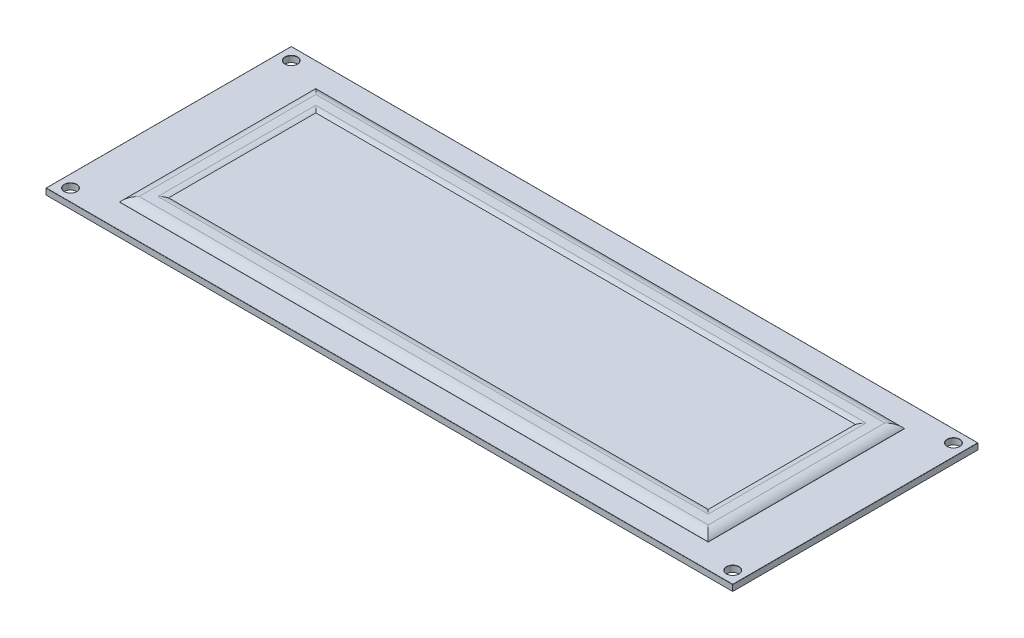
ISO-10303-21;
HEADER;
FILE_DESCRIPTION(('STEP AP214'),'2;1');
FILE_NAME('part.step','',(''),(''),'','','');
FILE_SCHEMA(('AUTOMOTIVE_DESIGN { 1 0 10303 214 1 1 1 1 }'));
ENDSEC;
DATA;
#1=APPLICATION_CONTEXT('core data for automotive mechanical design processes');
#2=APPLICATION_PROTOCOL_DEFINITION('international standard','automotive_design',2000,#1);
#3=PRODUCT_CONTEXT('',#1,'mechanical');
#4=PRODUCT('Part','Part','',(#3));
#5=PRODUCT_RELATED_PRODUCT_CATEGORY('part','',(#4));
#6=PRODUCT_DEFINITION_FORMATION('','',#4);
#7=PRODUCT_DEFINITION_CONTEXT('part definition',#1,'design');
#8=PRODUCT_DEFINITION('design','',#6,#7);
#9=PRODUCT_DEFINITION_SHAPE('','',#8);
#10=(LENGTH_UNIT() NAMED_UNIT(*) SI_UNIT(.MILLI.,.METRE.));
#11=(NAMED_UNIT(*) PLANE_ANGLE_UNIT() SI_UNIT($,.RADIAN.));
#12=(NAMED_UNIT(*) SI_UNIT($,.STERADIAN.) SOLID_ANGLE_UNIT());
#13=UNCERTAINTY_MEASURE_WITH_UNIT(LENGTH_MEASURE(1.E-05),#10,'distance_accuracy_value','');
#14=(GEOMETRIC_REPRESENTATION_CONTEXT(3) GLOBAL_UNCERTAINTY_ASSIGNED_CONTEXT((#13)) GLOBAL_UNIT_ASSIGNED_CONTEXT((#10,
#11,#12)) REPRESENTATION_CONTEXT('',''));
#15=CARTESIAN_POINT('',(0.,0.,0.));
#16=DIRECTION('',(0.,0.,1.));
#17=DIRECTION('',(1.,0.,0.));
#18=AXIS2_PLACEMENT_3D('',#15,#16,#17);
#19=CARTESIAN_POINT('',(120.441055718475,2.5,-153.293841642229));
#20=DIRECTION('',(1.,0.,0.));
#21=DIRECTION('',(0.,0.,-1.));
#22=AXIS2_PLACEMENT_3D('',#19,#20,#21);
#23=PLANE('',#22);
#24=DIRECTION('',(0.,-1.,0.));
#25=VECTOR('',#24,1.);
#26=CARTESIAN_POINT('',(120.441055718475,2.5,-53.2938416422287));
#27=LINE('',#26,#25);
#28=CARTESIAN_POINT('',(120.441055718475,2.4,-53.2938416422287));
#29=VERTEX_POINT('',#28);
#30=CARTESIAN_POINT('',(120.441055718475,0.,-53.2938416422287));
#31=VERTEX_POINT('',#30);
#32=EDGE_CURVE('E202',#29,#31,#27,.T.);
#33=ORIENTED_EDGE('',*,*,#32,.F.);
#34=DIRECTION('',(0.,0.,1.));
#35=VECTOR('',#34,1.);
#36=CARTESIAN_POINT('',(120.441055718475,2.4,-153.293841642229));
#37=LINE('',#36,#35);
#38=CARTESIAN_POINT('',(120.441055718475,2.4,-153.293841642229));
#39=VERTEX_POINT('',#38);
#40=EDGE_CURVE('E283',#29,#39,#37,.F.);
#41=ORIENTED_EDGE('',*,*,#40,.T.);
#42=DIRECTION('',(0.,-1.,0.));
#43=VECTOR('',#42,1.);
#44=CARTESIAN_POINT('',(120.441055718475,2.5,-153.293841642229));
#45=LINE('',#44,#43);
#46=CARTESIAN_POINT('',(120.441055718475,0.,-153.293841642229));
#47=VERTEX_POINT('',#46);
#48=EDGE_CURVE('E196',#39,#47,#45,.T.);
#49=ORIENTED_EDGE('',*,*,#48,.T.);
#50=DIRECTION('',(0.,0.,1.));
#51=VECTOR('',#50,1.);
#52=CARTESIAN_POINT('',(120.441055718475,0.,-153.293841642229));
#53=LINE('',#52,#51);
#54=EDGE_CURVE('E184',#47,#31,#53,.T.);
#55=ORIENTED_EDGE('',*,*,#54,.T.);
#56=EDGE_LOOP('',(#33,#41,#49,#55));
#57=FACE_BOUND('',#56,.T.);
#58=ADVANCED_FACE('F37',(#57),#23,.F.);
#59=CARTESIAN_POINT('',(120.441055718475,2.5,-53.2938416422287));
#60=DIRECTION('',(0.,0.,-1.));
#61=DIRECTION('',(-1.,0.,0.));
#62=AXIS2_PLACEMENT_3D('',#59,#60,#61);
#63=PLANE('',#62);
#64=DIRECTION('',(0.,-1.,0.));
#65=VECTOR('',#64,1.);
#66=CARTESIAN_POINT('',(400.441055718475,2.5,-53.2938416422287));
#67=LINE('',#66,#65);
#68=CARTESIAN_POINT('',(400.441055718475,2.4,-53.2938416422287));
#69=VERTEX_POINT('',#68);
#70=CARTESIAN_POINT('',(400.441055718475,0.,-53.2938416422287));
#71=VERTEX_POINT('',#70);
#72=EDGE_CURVE('E200',#69,#71,#67,.T.);
#73=ORIENTED_EDGE('',*,*,#72,.F.);
#74=DIRECTION('',(1.,0.,0.));
#75=VECTOR('',#74,1.);
#76=CARTESIAN_POINT('',(120.441055718475,2.4,-53.2938416422287));
#77=LINE('',#76,#75);
#78=EDGE_CURVE('E281',#69,#29,#77,.F.);
#79=ORIENTED_EDGE('',*,*,#78,.T.);
#80=ORIENTED_EDGE('',*,*,#32,.T.);
#81=DIRECTION('',(1.,0.,0.));
#82=VECTOR('',#81,1.);
#83=CARTESIAN_POINT('',(120.441055718475,0.,-53.2938416422287));
#84=LINE('',#83,#82);
#85=EDGE_CURVE('E187',#31,#71,#84,.T.);
#86=ORIENTED_EDGE('',*,*,#85,.T.);
#87=EDGE_LOOP('',(#73,#79,#80,#86));
#88=FACE_BOUND('',#87,.T.);
#89=ADVANCED_FACE('F363',(#88),#63,.F.);
#90=CARTESIAN_POINT('',(400.441055718475,2.5,-153.293841642229));
#91=DIRECTION('',(-1.,0.,0.));
#92=DIRECTION('',(0.,0.,1.));
#93=AXIS2_PLACEMENT_3D('',#90,#91,#92);
#94=PLANE('',#93);
#95=DIRECTION('',(0.,-1.,0.));
#96=VECTOR('',#95,1.);
#97=CARTESIAN_POINT('',(400.441055718475,2.5,-153.293841642229));
#98=LINE('',#97,#96);
#99=CARTESIAN_POINT('',(400.441055718475,2.4,-153.293841642229));
#100=VERTEX_POINT('',#99);
#101=CARTESIAN_POINT('',(400.441055718475,0.,-153.293841642229));
#102=VERTEX_POINT('',#101);
#103=EDGE_CURVE('E198',#100,#102,#98,.T.);
#104=ORIENTED_EDGE('',*,*,#103,.F.);
#105=DIRECTION('',(0.,0.,-1.));
#106=VECTOR('',#105,1.);
#107=CARTESIAN_POINT('',(400.441055718475,2.4,-53.2938416422287));
#108=LINE('',#107,#106);
#109=EDGE_CURVE('E279',#100,#69,#108,.F.);
#110=ORIENTED_EDGE('',*,*,#109,.T.);
#111=ORIENTED_EDGE('',*,*,#72,.T.);
#112=DIRECTION('',(0.,0.,-1.));
#113=VECTOR('',#112,1.);
#114=CARTESIAN_POINT('',(400.441055718475,0.,-153.293841642229));
#115=LINE('',#114,#113);
#116=EDGE_CURVE('E190',#71,#102,#115,.T.);
#117=ORIENTED_EDGE('',*,*,#116,.T.);
#118=EDGE_LOOP('',(#104,#110,#111,#117));
#119=FACE_BOUND('',#118,.T.);
#120=ADVANCED_FACE('F368',(#119),#94,.F.);
#121=CARTESIAN_POINT('',(120.441055718475,2.5,-153.293841642229));
#122=DIRECTION('',(0.,0.,1.));
#123=DIRECTION('',(1.,0.,0.));
#124=AXIS2_PLACEMENT_3D('',#121,#122,#123);
#125=PLANE('',#124);
#126=ORIENTED_EDGE('',*,*,#48,.F.);
#127=DIRECTION('',(-1.,0.,0.));
#128=VECTOR('',#127,1.);
#129=CARTESIAN_POINT('',(400.441055718475,2.4,-153.293841642229));
#130=LINE('',#129,#128);
#131=EDGE_CURVE('E276',#39,#100,#130,.F.);
#132=ORIENTED_EDGE('',*,*,#131,.T.);
#133=ORIENTED_EDGE('',*,*,#103,.T.);
#134=DIRECTION('',(-1.,0.,0.));
#135=VECTOR('',#134,1.);
#136=CARTESIAN_POINT('',(120.441055718475,0.,-153.293841642229));
#137=LINE('',#136,#135);
#138=EDGE_CURVE('E193',#102,#47,#137,.T.);
#139=ORIENTED_EDGE('',*,*,#138,.T.);
#140=EDGE_LOOP('',(#126,#132,#133,#139));
#141=FACE_BOUND('',#140,.T.);
#142=ADVANCED_FACE('F375',(#141),#125,.F.);
#143=CARTESIAN_POINT('',(0.,2.5,0.));
#144=DIRECTION('',(0.,1.,0.));
#145=DIRECTION('',(0.,0.,1.));
#146=AXIS2_PLACEMENT_3D('',#143,#144,#145);
#147=PLANE('',#146);
#148=DIRECTION('',(0.,0.,-1.));
#149=VECTOR('',#148,1.);
#150=CARTESIAN_POINT('',(400.341055718475,2.5,-153.293841642229));
#151=LINE('',#150,#149);
#152=CARTESIAN_POINT('',(400.341055718475,2.5,-53.3938416422287));
#153=VERTEX_POINT('',#152);
#154=CARTESIAN_POINT('',(400.341055718475,2.5,-153.193841642229));
#155=VERTEX_POINT('',#154);
#156=EDGE_CURVE('E271',#153,#155,#151,.T.);
#157=ORIENTED_EDGE('',*,*,#156,.T.);
#158=DIRECTION('',(-1.,0.,0.));
#159=VECTOR('',#158,1.);
#160=CARTESIAN_POINT('',(120.441055718475,2.5,-153.193841642229));
#161=LINE('',#160,#159);
#162=CARTESIAN_POINT('',(120.541055718475,2.5,-153.193841642229));
#163=VERTEX_POINT('',#162);
#164=EDGE_CURVE('E273',#155,#163,#161,.T.);
#165=ORIENTED_EDGE('',*,*,#164,.T.);
#166=DIRECTION('',(0.,0.,1.));
#167=VECTOR('',#166,1.);
#168=CARTESIAN_POINT('',(120.541055718475,2.5,-53.2938416422287));
#169=LINE('',#168,#167);
#170=CARTESIAN_POINT('',(120.541055718475,2.5,-53.3938416422287));
#171=VERTEX_POINT('',#170);
#172=EDGE_CURVE('E267',#163,#171,#169,.T.);
#173=ORIENTED_EDGE('',*,*,#172,.T.);
#174=DIRECTION('',(1.,0.,0.));
#175=VECTOR('',#174,1.);
#176=CARTESIAN_POINT('',(400.441055718475,2.5,-53.3938416422287));
#177=LINE('',#176,#175);
#178=EDGE_CURVE('E269',#171,#153,#177,.T.);
#179=ORIENTED_EDGE('',*,*,#178,.T.);
#180=EDGE_LOOP('',(#157,#165,#173,#179));
#181=FACE_BOUND('',#180,.T.);
#182=DIRECTION('',(0.,0.,1.));
#183=VECTOR('',#182,1.);
#184=CARTESIAN_POINT('',(380.490747064739,2.5,-63.2938416422287));
#185=LINE('',#184,#183);
#186=CARTESIAN_POINT('',(380.490747064739,2.5,-143.343532988492));
#187=VERTEX_POINT('',#186);
#188=CARTESIAN_POINT('',(380.490747064739,2.5,-63.2441502959654));
#189=VERTEX_POINT('',#188);
#190=EDGE_CURVE('E262',#187,#189,#185,.T.);
#191=ORIENTED_EDGE('',*,*,#190,.T.);
#192=DIRECTION('',(-1.,0.,0.));
#193=VECTOR('',#192,1.);
#194=CARTESIAN_POINT('',(140.441055718475,2.5,-63.2441502959654));
#195=LINE('',#194,#193);
#196=CARTESIAN_POINT('',(140.391364372212,2.5,-63.2441502959654));
#197=VERTEX_POINT('',#196);
#198=EDGE_CURVE('E264',#189,#197,#195,.T.);
#199=ORIENTED_EDGE('',*,*,#198,.T.);
#200=DIRECTION('',(0.,0.,-1.));
#201=VECTOR('',#200,1.);
#202=CARTESIAN_POINT('',(140.391364372212,2.5,-143.293841642229));
#203=LINE('',#202,#201);
#204=CARTESIAN_POINT('',(140.391364372212,2.5,-143.343532988492));
#205=VERTEX_POINT('',#204);
#206=EDGE_CURVE('E258',#197,#205,#203,.T.);
#207=ORIENTED_EDGE('',*,*,#206,.T.);
#208=DIRECTION('',(1.,0.,0.));
#209=VECTOR('',#208,1.);
#210=CARTESIAN_POINT('',(380.441055718475,2.5,-143.343532988492));
#211=LINE('',#210,#209);
#212=EDGE_CURVE('E260',#205,#187,#211,.T.);
#213=ORIENTED_EDGE('',*,*,#212,.T.);
#214=EDGE_LOOP('',(#191,#199,#207,#213));
#215=FACE_BOUND('',#214,.T.);
#216=CARTESIAN_POINT('',(125.441055718475,2.5,-148.293841642229));
#217=DIRECTION('',(0.,1.,0.));
#218=DIRECTION('',(0.,0.,1.));
#219=AXIS2_PLACEMENT_3D('',#216,#217,#218);
#220=CIRCLE('',#219,2.6);
#221=CARTESIAN_POINT('',(125.441055718475,2.5,-145.693841642229));
#222=VERTEX_POINT('',#221);
#223=EDGE_CURVE('E255',#222,#222,#220,.F.);
#224=ORIENTED_EDGE('',*,*,#223,.T.);
#225=EDGE_LOOP('',(#224));
#226=FACE_BOUND('',#225,.T.);
#227=CARTESIAN_POINT('',(395.441055718475,2.5,-148.293841642229));
#228=DIRECTION('',(0.,1.,0.));
#229=DIRECTION('',(0.,0.,1.));
#230=AXIS2_PLACEMENT_3D('',#227,#228,#229);
#231=CIRCLE('',#230,2.60000000000002);
#232=CARTESIAN_POINT('',(395.441055718475,2.5,-145.693841642229));
#233=VERTEX_POINT('',#232);
#234=EDGE_CURVE('E252',#233,#233,#231,.F.);
#235=ORIENTED_EDGE('',*,*,#234,.T.);
#236=EDGE_LOOP('',(#235));
#237=FACE_BOUND('',#236,.T.);
#238=CARTESIAN_POINT('',(395.441055718475,2.5,-58.2938416422287));
#239=DIRECTION('',(0.,1.,0.));
#240=DIRECTION('',(0.,0.,1.));
#241=AXIS2_PLACEMENT_3D('',#238,#239,#240);
#242=CIRCLE('',#241,2.60000000000002);
#243=CARTESIAN_POINT('',(395.441055718475,2.5,-55.6938416422287));
#244=VERTEX_POINT('',#243);
#245=EDGE_CURVE('E249',#244,#244,#242,.F.);
#246=ORIENTED_EDGE('',*,*,#245,.T.);
#247=EDGE_LOOP('',(#246));
#248=FACE_BOUND('',#247,.T.);
#249=CARTESIAN_POINT('',(125.441055718475,2.5,-58.2938416422287));
#250=DIRECTION('',(0.,1.,0.));
#251=DIRECTION('',(0.,0.,1.));
#252=AXIS2_PLACEMENT_3D('',#249,#250,#251);
#253=CIRCLE('',#252,2.6);
#254=CARTESIAN_POINT('',(125.441055718475,2.5,-55.6938416422287));
#255=VERTEX_POINT('',#254);
#256=EDGE_CURVE('E221',#255,#255,#253,.F.);
#257=ORIENTED_EDGE('',*,*,#256,.T.);
#258=EDGE_LOOP('',(#257));
#259=FACE_BOUND('',#258,.T.);
#260=ADVANCED_FACE('F328',(#181,#215,#226,#237,#248,#259),#147,.T.);
#261=CARTESIAN_POINT('',(0.,0.,0.));
#262=DIRECTION('',(0.,1.,0.));
#263=DIRECTION('',(0.,0.,1.));
#264=AXIS2_PLACEMENT_3D('',#261,#262,#263);
#265=PLANE('',#264);
#266=CARTESIAN_POINT('',(125.441055718475,0.,-58.2938416422287));
#267=DIRECTION('',(0.,1.,0.));
#268=DIRECTION('',(0.,0.,1.));
#269=AXIS2_PLACEMENT_3D('',#266,#267,#268);
#270=CIRCLE('',#269,2.5);
#271=CARTESIAN_POINT('',(125.441055718475,0.,-55.7938416422287));
#272=VERTEX_POINT('',#271);
#273=EDGE_CURVE('E230',#272,#272,#270,.T.);
#274=ORIENTED_EDGE('',*,*,#273,.T.);
#275=EDGE_LOOP('',(#274));
#276=FACE_BOUND('',#275,.T.);
#277=CARTESIAN_POINT('',(395.441055718475,0.,-58.2938416422287));
#278=DIRECTION('',(0.,1.,0.));
#279=DIRECTION('',(0.,0.,1.));
#280=AXIS2_PLACEMENT_3D('',#277,#278,#279);
#281=CIRCLE('',#280,2.50000000000002);
#282=CARTESIAN_POINT('',(395.441055718475,0.,-55.7938416422287));
#283=VERTEX_POINT('',#282);
#284=EDGE_CURVE('E242',#283,#283,#281,.T.);
#285=ORIENTED_EDGE('',*,*,#284,.T.);
#286=EDGE_LOOP('',(#285));
#287=FACE_BOUND('',#286,.T.);
#288=CARTESIAN_POINT('',(395.441055718475,0.,-148.293841642229));
#289=DIRECTION('',(0.,1.,0.));
#290=DIRECTION('',(0.,0.,1.));
#291=AXIS2_PLACEMENT_3D('',#288,#289,#290);
#292=CIRCLE('',#291,2.50000000000002);
#293=CARTESIAN_POINT('',(395.441055718475,0.,-145.793841642229));
#294=VERTEX_POINT('',#293);
#295=EDGE_CURVE('E238',#294,#294,#292,.T.);
#296=ORIENTED_EDGE('',*,*,#295,.T.);
#297=EDGE_LOOP('',(#296));
#298=FACE_BOUND('',#297,.T.);
#299=CARTESIAN_POINT('',(125.441055718475,0.,-148.293841642229));
#300=DIRECTION('',(0.,1.,0.));
#301=DIRECTION('',(0.,0.,1.));
#302=AXIS2_PLACEMENT_3D('',#299,#300,#301);
#303=CIRCLE('',#302,2.5);
#304=CARTESIAN_POINT('',(125.441055718475,0.,-145.793841642229));
#305=VERTEX_POINT('',#304);
#306=EDGE_CURVE('E235',#305,#305,#303,.T.);
#307=ORIENTED_EDGE('',*,*,#306,.T.);
#308=EDGE_LOOP('',(#307));
#309=FACE_BOUND('',#308,.T.);
#310=ORIENTED_EDGE('',*,*,#54,.F.);
#311=ORIENTED_EDGE('',*,*,#138,.F.);
#312=ORIENTED_EDGE('',*,*,#116,.F.);
#313=ORIENTED_EDGE('',*,*,#85,.F.);
#314=EDGE_LOOP('',(#310,#311,#312,#313));
#315=FACE_BOUND('',#314,.T.);
#316=ADVANCED_FACE('F380',(#276,#287,#298,#309,#315),#265,.F.);
#317=CARTESIAN_POINT('',(0.,4.5,0.));
#318=DIRECTION('',(0.,1.,0.));
#319=DIRECTION('',(0.,0.,1.));
#320=AXIS2_PLACEMENT_3D('',#317,#318,#319);
#321=PLANE('',#320);
#322=DIRECTION('',(0.,0.,1.));
#323=VECTOR('',#322,1.);
#324=CARTESIAN_POINT('',(376.441055718475,4.5,-143.293841642229));
#325=LINE('',#324,#323);
#326=CARTESIAN_POINT('',(376.441055718475,4.5,-67.2938416422287));
#327=VERTEX_POINT('',#326);
#328=CARTESIAN_POINT('',(376.441055718475,4.5,-139.293841642229));
#329=VERTEX_POINT('',#328);
#330=EDGE_CURVE('E216',#327,#329,#325,.F.);
#331=ORIENTED_EDGE('',*,*,#330,.T.);
#332=DIRECTION('',(1.,0.,0.));
#333=VECTOR('',#332,1.);
#334=CARTESIAN_POINT('',(140.441055718475,4.5,-139.293841642229));
#335=LINE('',#334,#333);
#336=CARTESIAN_POINT('',(144.441055718475,4.5,-139.293841642229));
#337=VERTEX_POINT('',#336);
#338=EDGE_CURVE('E218',#329,#337,#335,.F.);
#339=ORIENTED_EDGE('',*,*,#338,.T.);
#340=DIRECTION('',(0.,0.,-1.));
#341=VECTOR('',#340,1.);
#342=CARTESIAN_POINT('',(144.441055718475,4.5,-63.2938416422287));
#343=LINE('',#342,#341);
#344=CARTESIAN_POINT('',(144.441055718475,4.5,-67.2938416422287));
#345=VERTEX_POINT('',#344);
#346=EDGE_CURVE('E211',#337,#345,#343,.F.);
#347=ORIENTED_EDGE('',*,*,#346,.T.);
#348=DIRECTION('',(-1.,0.,0.));
#349=VECTOR('',#348,1.);
#350=CARTESIAN_POINT('',(380.441055718475,4.5,-67.2938416422287));
#351=LINE('',#350,#349);
#352=EDGE_CURVE('E214',#345,#327,#351,.F.);
#353=ORIENTED_EDGE('',*,*,#352,.T.);
#354=EDGE_LOOP('',(#331,#339,#347,#353));
#355=FACE_BOUND('',#354,.T.);
#356=DIRECTION('',(0.,0.,-1.));
#357=VECTOR('',#356,1.);
#358=CARTESIAN_POINT('',(372.620505190246,4.5,-73.2938416422287));
#359=LINE('',#358,#357);
#360=CARTESIAN_POINT('',(372.620505190246,4.5,-135.473291113999));
#361=VERTEX_POINT('',#360);
#362=CARTESIAN_POINT('',(372.620505190246,4.5,-71.1143921704584));
#363=VERTEX_POINT('',#362);
#364=EDGE_CURVE('E207',#361,#363,#359,.F.);
#365=ORIENTED_EDGE('',*,*,#364,.T.);
#366=DIRECTION('',(1.,0.,0.));
#367=VECTOR('',#366,1.);
#368=CARTESIAN_POINT('',(150.441055718475,4.5,-71.1143921704584));
#369=LINE('',#368,#367);
#370=CARTESIAN_POINT('',(148.261606246705,4.5,-71.1143921704584));
#371=VERTEX_POINT('',#370);
#372=EDGE_CURVE('E209',#363,#371,#369,.F.);
#373=ORIENTED_EDGE('',*,*,#372,.T.);
#374=DIRECTION('',(0.,0.,1.));
#375=VECTOR('',#374,1.);
#376=CARTESIAN_POINT('',(148.261606246705,4.5,-133.293841642229));
#377=LINE('',#376,#375);
#378=CARTESIAN_POINT('',(148.261606246705,4.5,-135.473291113999));
#379=VERTEX_POINT('',#378);
#380=EDGE_CURVE('E169',#371,#379,#377,.F.);
#381=ORIENTED_EDGE('',*,*,#380,.T.);
#382=DIRECTION('',(-1.,0.,0.));
#383=VECTOR('',#382,1.);
#384=CARTESIAN_POINT('',(370.441055718475,4.5,-135.473291113999));
#385=LINE('',#384,#383);
#386=EDGE_CURVE('E205',#379,#361,#385,.F.);
#387=ORIENTED_EDGE('',*,*,#386,.T.);
#388=EDGE_LOOP('',(#365,#373,#381,#387));
#389=FACE_BOUND('',#388,.T.);
#390=ADVANCED_FACE('F345',(#355,#389),#321,.T.);
#391=CARTESIAN_POINT('',(0.,4.,0.));
#392=DIRECTION('',(0.,1.,0.));
#393=DIRECTION('',(0.,0.,1.));
#394=AXIS2_PLACEMENT_3D('',#391,#392,#393);
#395=PLANE('',#394);
#396=DIRECTION('',(0.,0.,1.));
#397=VECTOR('',#396,1.);
#398=CARTESIAN_POINT('',(150.441055718475,4.,-133.293841642229));
#399=LINE('',#398,#397);
#400=CARTESIAN_POINT('',(150.441055718475,4.,-133.293841642229));
#401=VERTEX_POINT('',#400);
#402=CARTESIAN_POINT('',(150.441055718475,4.,-73.2938416422287));
#403=VERTEX_POINT('',#402);
#404=EDGE_CURVE('E154',#401,#403,#399,.T.);
#405=ORIENTED_EDGE('',*,*,#404,.T.);
#406=DIRECTION('',(1.,0.,0.));
#407=VECTOR('',#406,1.);
#408=CARTESIAN_POINT('',(150.441055718475,4.,-73.2938416422287));
#409=LINE('',#408,#407);
#410=CARTESIAN_POINT('',(370.441055718475,4.,-73.2938416422287));
#411=VERTEX_POINT('',#410);
#412=EDGE_CURVE('E158',#403,#411,#409,.T.);
#413=ORIENTED_EDGE('',*,*,#412,.T.);
#414=DIRECTION('',(0.,0.,-1.));
#415=VECTOR('',#414,1.);
#416=CARTESIAN_POINT('',(370.441055718475,4.,-133.293841642229));
#417=LINE('',#416,#415);
#418=CARTESIAN_POINT('',(370.441055718475,4.,-133.293841642229));
#419=VERTEX_POINT('',#418);
#420=EDGE_CURVE('E179',#411,#419,#417,.T.);
#421=ORIENTED_EDGE('',*,*,#420,.T.);
#422=DIRECTION('',(-1.,0.,0.));
#423=VECTOR('',#422,1.);
#424=CARTESIAN_POINT('',(150.441055718475,4.,-133.293841642229));
#425=LINE('',#424,#423);
#426=EDGE_CURVE('E160',#419,#401,#425,.T.);
#427=ORIENTED_EDGE('',*,*,#426,.T.);
#428=EDGE_LOOP('',(#405,#413,#421,#427));
#429=FACE_BOUND('',#428,.T.);
#430=ADVANCED_FACE('F156',(#429),#395,.T.);
#431=CARTESIAN_POINT('',(140.441055718475,-0.5,-67.2938416422287));
#432=DIRECTION('',(1.,0.,0.));
#433=DIRECTION('',(0.,0.,-1.));
#434=AXIS2_PLACEMENT_3D('',#431,#432,#433);
#435=CYLINDRICAL_SURFACE('',#434,5.);
#436=CARTESIAN_POINT('',(144.441055718475,-0.5,-67.2938416422287));
#437=DIRECTION('',(0.707106781186547,0.,0.707106781186547));
#438=DIRECTION('',(-0.707106781186547,0.,0.707106781186547));
#439=AXIS2_PLACEMENT_3D('',#436,#437,#438);
#440=ELLIPSE('',#439,7.07106781186547,5.);
#441=CARTESIAN_POINT('',(140.470770084884,2.53921568627452,-63.3235560086372));
#442=VERTEX_POINT('',#441);
#443=EDGE_CURVE('E227',#442,#345,#440,.F.);
#444=ORIENTED_EDGE('',*,*,#443,.F.);
#445=DIRECTION('',(1.,0.,0.));
#446=VECTOR('',#445,1.);
#447=CARTESIAN_POINT('',(140.441055718475,2.53921568627451,-63.3235560086372));
#448=LINE('',#447,#446);
#449=CARTESIAN_POINT('',(380.411341352067,2.53921568627452,-63.3235560086372));
#450=VERTEX_POINT('',#449);
#451=EDGE_CURVE('E285',#442,#450,#448,.T.);
#452=ORIENTED_EDGE('',*,*,#451,.T.);
#453=CARTESIAN_POINT('',(376.441055718475,-0.5,-67.2938416422287));
#454=DIRECTION('',(0.707106781186547,0.,-0.707106781186547));
#455=DIRECTION('',(0.707106781186547,0.,0.707106781186547));
#456=AXIS2_PLACEMENT_3D('',#453,#454,#455);
#457=ELLIPSE('',#456,7.07106781186547,5.);
#458=EDGE_CURVE('E164',#327,#450,#457,.T.);
#459=ORIENTED_EDGE('',*,*,#458,.F.);
#460=ORIENTED_EDGE('',*,*,#352,.F.);
#461=EDGE_LOOP('',(#444,#452,#459,#460));
#462=FACE_BOUND('',#461,.T.);
#463=ADVANCED_FACE('F339',(#462),#435,.T.);
#464=CARTESIAN_POINT('',(376.441055718475,-0.5,-143.293841642229));
#465=DIRECTION('',(0.,0.,-1.));
#466=DIRECTION('',(-1.,0.,0.));
#467=AXIS2_PLACEMENT_3D('',#464,#465,#466);
#468=CYLINDRICAL_SURFACE('',#467,5.);
#469=ORIENTED_EDGE('',*,*,#458,.T.);
#470=DIRECTION('',(0.,0.,-1.));
#471=VECTOR('',#470,1.);
#472=CARTESIAN_POINT('',(380.411341352067,2.53921568627452,-143.293841642229));
#473=LINE('',#472,#471);
#474=CARTESIAN_POINT('',(380.411341352067,2.53921568627452,-143.26412727582));
#475=VERTEX_POINT('',#474);
#476=EDGE_CURVE('E62',#450,#475,#473,.T.);
#477=ORIENTED_EDGE('',*,*,#476,.T.);
#478=CARTESIAN_POINT('',(376.441055718475,-0.5,-139.293841642229));
#479=DIRECTION('',(-0.707106781186547,0.,-0.707106781186547));
#480=DIRECTION('',(0.707106781186547,0.,-0.707106781186547));
#481=AXIS2_PLACEMENT_3D('',#478,#479,#480);
#482=ELLIPSE('',#481,7.07106781186547,5.);
#483=EDGE_CURVE('E224',#329,#475,#482,.T.);
#484=ORIENTED_EDGE('',*,*,#483,.F.);
#485=ORIENTED_EDGE('',*,*,#330,.F.);
#486=EDGE_LOOP('',(#469,#477,#484,#485));
#487=FACE_BOUND('',#486,.T.);
#488=ADVANCED_FACE('F342',(#487),#468,.T.);
#489=CARTESIAN_POINT('',(144.441055718475,-0.5,-143.293841642229));
#490=DIRECTION('',(0.,0.,1.));
#491=DIRECTION('',(1.,0.,0.));
#492=AXIS2_PLACEMENT_3D('',#489,#490,#491);
#493=CYLINDRICAL_SURFACE('',#492,5.);
#494=CARTESIAN_POINT('',(144.441055718475,-0.5,-139.293841642229));
#495=DIRECTION('',(-0.707106781186547,0.,0.707106781186547));
#496=DIRECTION('',(0.707106781186547,0.,0.707106781186547));
#497=AXIS2_PLACEMENT_3D('',#494,#495,#496);
#498=ELLIPSE('',#497,7.07106781186547,5.);
#499=CARTESIAN_POINT('',(140.470770084884,2.53921568627452,-143.26412727582));
#500=VERTEX_POINT('',#499);
#501=EDGE_CURVE('E222',#500,#337,#498,.F.);
#502=ORIENTED_EDGE('',*,*,#501,.F.);
#503=DIRECTION('',(0.,0.,1.));
#504=VECTOR('',#503,1.);
#505=CARTESIAN_POINT('',(140.470770084884,2.53921568627452,-143.293841642229));
#506=LINE('',#505,#504);
#507=EDGE_CURVE('E290',#500,#442,#506,.T.);
#508=ORIENTED_EDGE('',*,*,#507,.T.);
#509=ORIENTED_EDGE('',*,*,#443,.T.);
#510=ORIENTED_EDGE('',*,*,#346,.F.);
#511=EDGE_LOOP('',(#502,#508,#509,#510));
#512=FACE_BOUND('',#511,.T.);
#513=ADVANCED_FACE('F349',(#512),#493,.T.);
#514=CARTESIAN_POINT('',(140.441055718475,-0.5,-139.293841642229));
#515=DIRECTION('',(-1.,0.,0.));
#516=DIRECTION('',(0.,0.,1.));
#517=AXIS2_PLACEMENT_3D('',#514,#515,#516);
#518=CYLINDRICAL_SURFACE('',#517,5.);
#519=ORIENTED_EDGE('',*,*,#483,.T.);
#520=DIRECTION('',(-1.,0.,0.));
#521=VECTOR('',#520,1.);
#522=CARTESIAN_POINT('',(140.441055718475,2.53921568627452,-143.26412727582));
#523=LINE('',#522,#521);
#524=EDGE_CURVE('E54',#475,#500,#523,.T.);
#525=ORIENTED_EDGE('',*,*,#524,.T.);
#526=ORIENTED_EDGE('',*,*,#501,.T.);
#527=ORIENTED_EDGE('',*,*,#338,.F.);
#528=EDGE_LOOP('',(#519,#525,#526,#527));
#529=FACE_BOUND('',#528,.T.);
#530=ADVANCED_FACE('F350',(#529),#518,.T.);
#531=CARTESIAN_POINT('',(150.441055718475,-0.5,-135.473291113999));
#532=DIRECTION('',(1.,0.,0.));
#533=DIRECTION('',(0.,0.,-1.));
#534=AXIS2_PLACEMENT_3D('',#531,#532,#533);
#535=CYLINDRICAL_SURFACE('',#534,5.);
#536=CARTESIAN_POINT('',(372.620505190246,-0.5,-135.473291113999));
#537=DIRECTION('',(0.707106781186547,0.,0.707106781186547));
#538=DIRECTION('',(-0.707106781186547,0.,0.707106781186547));
#539=AXIS2_PLACEMENT_3D('',#536,#537,#538);
#540=ELLIPSE('',#539,7.07106781186547,5.);
#541=EDGE_CURVE('E173',#361,#419,#540,.T.);
#542=ORIENTED_EDGE('',*,*,#541,.F.);
#543=ORIENTED_EDGE('',*,*,#386,.F.);
#544=CARTESIAN_POINT('',(148.261606246705,-0.5,-135.473291113999));
#545=DIRECTION('',(0.707106781186547,0.,-0.707106781186547));
#546=DIRECTION('',(0.707106781186547,0.,0.707106781186547));
#547=AXIS2_PLACEMENT_3D('',#544,#545,#546);
#548=ELLIPSE('',#547,7.07106781186547,5.);
#549=EDGE_CURVE('E225',#401,#379,#548,.F.);
#550=ORIENTED_EDGE('',*,*,#549,.F.);
#551=ORIENTED_EDGE('',*,*,#426,.F.);
#552=EDGE_LOOP('',(#542,#543,#550,#551));
#553=FACE_BOUND('',#552,.T.);
#554=ADVANCED_FACE('F352',(#553),#535,.T.);
#555=CARTESIAN_POINT('',(148.261606246705,-0.5,-133.293841642229));
#556=DIRECTION('',(0.,0.,-1.));
#557=DIRECTION('',(-1.,0.,0.));
#558=AXIS2_PLACEMENT_3D('',#555,#556,#557);
#559=CYLINDRICAL_SURFACE('',#558,5.);
#560=ORIENTED_EDGE('',*,*,#549,.T.);
#561=ORIENTED_EDGE('',*,*,#380,.F.);
#562=CARTESIAN_POINT('',(148.261606246705,-0.5,-71.1143921704584));
#563=DIRECTION('',(-0.707106781186547,0.,-0.707106781186547));
#564=DIRECTION('',(-0.707106781186547,0.,0.707106781186547));
#565=AXIS2_PLACEMENT_3D('',#562,#563,#564);
#566=ELLIPSE('',#565,7.07106781186547,5.);
#567=EDGE_CURVE('E167',#403,#371,#566,.F.);
#568=ORIENTED_EDGE('',*,*,#567,.F.);
#569=ORIENTED_EDGE('',*,*,#404,.F.);
#570=EDGE_LOOP('',(#560,#561,#568,#569));
#571=FACE_BOUND('',#570,.T.);
#572=ADVANCED_FACE('F168',(#571),#559,.T.);
#573=CARTESIAN_POINT('',(372.620505190246,-0.5,-133.293841642229));
#574=DIRECTION('',(0.,0.,1.));
#575=DIRECTION('',(1.,0.,0.));
#576=AXIS2_PLACEMENT_3D('',#573,#574,#575);
#577=CYLINDRICAL_SURFACE('',#576,5.);
#578=ORIENTED_EDGE('',*,*,#541,.T.);
#579=ORIENTED_EDGE('',*,*,#420,.F.);
#580=CARTESIAN_POINT('',(372.620505190246,-0.5,-71.1143921704584));
#581=DIRECTION('',(-0.707106781186547,0.,0.707106781186547));
#582=DIRECTION('',(-0.707106781186547,0.,-0.707106781186547));
#583=AXIS2_PLACEMENT_3D('',#580,#581,#582);
#584=ELLIPSE('',#583,7.07106781186547,5.);
#585=EDGE_CURVE('E174',#363,#411,#584,.T.);
#586=ORIENTED_EDGE('',*,*,#585,.F.);
#587=ORIENTED_EDGE('',*,*,#364,.F.);
#588=EDGE_LOOP('',(#578,#579,#586,#587));
#589=FACE_BOUND('',#588,.T.);
#590=ADVANCED_FACE('F647',(#589),#577,.T.);
#591=CARTESIAN_POINT('',(150.441055718475,-0.5,-71.1143921704584));
#592=DIRECTION('',(-1.,0.,0.));
#593=DIRECTION('',(0.,0.,1.));
#594=AXIS2_PLACEMENT_3D('',#591,#592,#593);
#595=CYLINDRICAL_SURFACE('',#594,5.);
#596=ORIENTED_EDGE('',*,*,#567,.T.);
#597=ORIENTED_EDGE('',*,*,#372,.F.);
#598=ORIENTED_EDGE('',*,*,#585,.T.);
#599=ORIENTED_EDGE('',*,*,#412,.F.);
#600=EDGE_LOOP('',(#596,#597,#598,#599));
#601=FACE_BOUND('',#600,.T.);
#602=ADVANCED_FACE('F176',(#601),#595,.T.);
#603=CARTESIAN_POINT('',(125.441055718475,-27.5,-148.293841642229));
#604=DIRECTION('',(0.,1.,0.));
#605=DIRECTION('',(0.,0.,1.));
#606=AXIS2_PLACEMENT_3D('',#603,#604,#605);
#607=CYLINDRICAL_SURFACE('',#606,2.5);
#608=CARTESIAN_POINT('',(125.441055718475,2.4,-148.293841642229));
#609=DIRECTION('',(0.,1.,0.));
#610=DIRECTION('',(0.,0.,1.));
#611=AXIS2_PLACEMENT_3D('',#608,#609,#610);
#612=CIRCLE('',#611,2.5);
#613=CARTESIAN_POINT('',(125.441055718475,2.4,-145.793841642229));
#614=VERTEX_POINT('',#613);
#615=EDGE_CURVE('E292',#614,#614,#612,.T.);
#616=ORIENTED_EDGE('',*,*,#615,.T.);
#617=EDGE_LOOP('',(#616));
#618=FACE_BOUND('',#617,.T.);
#619=ORIENTED_EDGE('',*,*,#306,.F.);
#620=EDGE_LOOP('',(#619));
#621=FACE_BOUND('',#620,.T.);
#622=ADVANCED_FACE('F391',(#618,#621),#607,.F.);
#623=CARTESIAN_POINT('',(395.441055718475,-27.5,-148.293841642229));
#624=DIRECTION('',(0.,1.,0.));
#625=DIRECTION('',(0.,0.,1.));
#626=AXIS2_PLACEMENT_3D('',#623,#624,#625);
#627=CYLINDRICAL_SURFACE('',#626,2.50000000000002);
#628=CARTESIAN_POINT('',(395.441055718475,2.4,-148.293841642229));
#629=DIRECTION('',(0.,1.,0.));
#630=DIRECTION('',(0.,0.,1.));
#631=AXIS2_PLACEMENT_3D('',#628,#629,#630);
#632=CIRCLE('',#631,2.50000000000002);
#633=CARTESIAN_POINT('',(395.441055718475,2.4,-145.793841642229));
#634=VERTEX_POINT('',#633);
#635=EDGE_CURVE('E295',#634,#634,#632,.T.);
#636=ORIENTED_EDGE('',*,*,#635,.T.);
#637=EDGE_LOOP('',(#636));
#638=FACE_BOUND('',#637,.T.);
#639=ORIENTED_EDGE('',*,*,#295,.F.);
#640=EDGE_LOOP('',(#639));
#641=FACE_BOUND('',#640,.T.);
#642=ADVANCED_FACE('F394',(#638,#641),#627,.F.);
#643=CARTESIAN_POINT('',(395.441055718475,-27.5,-58.2938416422287));
#644=DIRECTION('',(0.,1.,0.));
#645=DIRECTION('',(0.,0.,1.));
#646=AXIS2_PLACEMENT_3D('',#643,#644,#645);
#647=CYLINDRICAL_SURFACE('',#646,2.50000000000002);
#648=CARTESIAN_POINT('',(395.441055718475,2.4,-58.2938416422287));
#649=DIRECTION('',(0.,1.,0.));
#650=DIRECTION('',(0.,0.,1.));
#651=AXIS2_PLACEMENT_3D('',#648,#649,#650);
#652=CIRCLE('',#651,2.50000000000002);
#653=CARTESIAN_POINT('',(395.441055718475,2.4,-55.7938416422287));
#654=VERTEX_POINT('',#653);
#655=EDGE_CURVE('E46',#654,#654,#652,.T.);
#656=ORIENTED_EDGE('',*,*,#655,.T.);
#657=EDGE_LOOP('',(#656));
#658=FACE_BOUND('',#657,.T.);
#659=ORIENTED_EDGE('',*,*,#284,.F.);
#660=EDGE_LOOP('',(#659));
#661=FACE_BOUND('',#660,.T.);
#662=ADVANCED_FACE('F400',(#658,#661),#647,.F.);
#663=CARTESIAN_POINT('',(125.441055718475,-27.5,-58.2938416422287));
#664=DIRECTION('',(0.,1.,0.));
#665=DIRECTION('',(0.,0.,1.));
#666=AXIS2_PLACEMENT_3D('',#663,#664,#665);
#667=CYLINDRICAL_SURFACE('',#666,2.5);
#668=CARTESIAN_POINT('',(125.441055718475,2.4,-58.2938416422287));
#669=DIRECTION('',(0.,1.,0.));
#670=DIRECTION('',(0.,0.,1.));
#671=AXIS2_PLACEMENT_3D('',#668,#669,#670);
#672=CIRCLE('',#671,2.5);
#673=CARTESIAN_POINT('',(125.441055718475,2.4,-55.7938416422287));
#674=VERTEX_POINT('',#673);
#675=EDGE_CURVE('E11',#674,#674,#672,.T.);
#676=ORIENTED_EDGE('',*,*,#675,.T.);
#677=EDGE_LOOP('',(#676));
#678=FACE_BOUND('',#677,.T.);
#679=ORIENTED_EDGE('',*,*,#273,.F.);
#680=EDGE_LOOP('',(#679));
#681=FACE_BOUND('',#680,.T.);
#682=ADVANCED_FACE('F396',(#678,#681),#667,.F.);
#683=CARTESIAN_POINT('',(0.,2.4,-53.3938416422287));
#684=DIRECTION('',(-1.,0.,0.));
#685=DIRECTION('',(0.,0.,1.));
#686=AXIS2_PLACEMENT_3D('',#683,#684,#685);
#687=CYLINDRICAL_SURFACE('',#686,0.1);
#688=CARTESIAN_POINT('',(120.541055718475,2.4,-53.3938416422287));
#689=DIRECTION('',(-0.707106781186548,0.,-0.707106781186547));
#690=DIRECTION('',(0.707106781186547,0.,-0.707106781186548));
#691=AXIS2_PLACEMENT_3D('',#688,#689,#690);
#692=ELLIPSE('',#691,0.141421356237309,0.1);
#693=EDGE_CURVE('E304',#29,#171,#692,.T.);
#694=ORIENTED_EDGE('',*,*,#693,.F.);
#695=ORIENTED_EDGE('',*,*,#78,.F.);
#696=CARTESIAN_POINT('',(400.341055718475,2.4,-53.3938416422287));
#697=DIRECTION('',(-0.707106781186547,0.,0.707106781186548));
#698=DIRECTION('',(-0.707106781186548,0.,-0.707106781186547));
#699=AXIS2_PLACEMENT_3D('',#696,#697,#698);
#700=ELLIPSE('',#699,0.14142135623731,0.1);
#701=EDGE_CURVE('E239',#153,#69,#700,.F.);
#702=ORIENTED_EDGE('',*,*,#701,.F.);
#703=ORIENTED_EDGE('',*,*,#178,.F.);
#704=EDGE_LOOP('',(#694,#695,#702,#703));
#705=FACE_BOUND('',#704,.T.);
#706=ADVANCED_FACE('F399',(#705),#687,.T.);
#707=CARTESIAN_POINT('',(400.341055718475,2.4,-2.22233928880697E-13));
#708=DIRECTION('',(0.,0.,1.));
#709=DIRECTION('',(1.,0.,0.));
#710=AXIS2_PLACEMENT_3D('',#707,#708,#709);
#711=CYLINDRICAL_SURFACE('',#710,0.1);
#712=ORIENTED_EDGE('',*,*,#701,.T.);
#713=ORIENTED_EDGE('',*,*,#109,.F.);
#714=CARTESIAN_POINT('',(400.341055718475,2.4,-153.193841642229));
#715=DIRECTION('',(0.707106781186548,0.,0.707106781186547));
#716=DIRECTION('',(-0.707106781186547,0.,0.707106781186548));
#717=AXIS2_PLACEMENT_3D('',#714,#715,#716);
#718=ELLIPSE('',#717,0.141421356237309,0.1);
#719=EDGE_CURVE('E302',#155,#100,#718,.F.);
#720=ORIENTED_EDGE('',*,*,#719,.F.);
#721=ORIENTED_EDGE('',*,*,#156,.F.);
#722=EDGE_LOOP('',(#712,#713,#720,#721));
#723=FACE_BOUND('',#722,.T.);
#724=ADVANCED_FACE('F433',(#723),#711,.T.);
#725=CARTESIAN_POINT('',(120.541055718475,2.4,0.));
#726=DIRECTION('',(0.,0.,-1.));
#727=DIRECTION('',(-1.,0.,0.));
#728=AXIS2_PLACEMENT_3D('',#725,#726,#727);
#729=CYLINDRICAL_SURFACE('',#728,0.1);
#730=ORIENTED_EDGE('',*,*,#693,.T.);
#731=ORIENTED_EDGE('',*,*,#172,.F.);
#732=CARTESIAN_POINT('',(120.541055718475,2.4,-153.193841642229));
#733=DIRECTION('',(0.707106781186547,0.,-0.707106781186548));
#734=DIRECTION('',(-0.707106781186548,0.,-0.707106781186547));
#735=AXIS2_PLACEMENT_3D('',#732,#733,#734);
#736=ELLIPSE('',#735,0.14142135623731,0.1);
#737=EDGE_CURVE('E300',#39,#163,#736,.T.);
#738=ORIENTED_EDGE('',*,*,#737,.F.);
#739=ORIENTED_EDGE('',*,*,#40,.F.);
#740=EDGE_LOOP('',(#730,#731,#738,#739));
#741=FACE_BOUND('',#740,.T.);
#742=ADVANCED_FACE('F438',(#741),#729,.T.);
#743=CARTESIAN_POINT('',(0.,2.4,-153.193841642229));
#744=DIRECTION('',(1.,0.,0.));
#745=DIRECTION('',(0.,0.,-1.));
#746=AXIS2_PLACEMENT_3D('',#743,#744,#745);
#747=CYLINDRICAL_SURFACE('',#746,0.1);
#748=ORIENTED_EDGE('',*,*,#719,.T.);
#749=ORIENTED_EDGE('',*,*,#131,.F.);
#750=ORIENTED_EDGE('',*,*,#737,.T.);
#751=ORIENTED_EDGE('',*,*,#164,.F.);
#752=EDGE_LOOP('',(#748,#749,#750,#751));
#753=FACE_BOUND('',#752,.T.);
#754=ADVANCED_FACE('F441',(#753),#747,.T.);
#755=CARTESIAN_POINT('',(140.441055718475,2.6,-143.343532988492));
#756=DIRECTION('',(-1.,0.,0.));
#757=DIRECTION('',(0.,0.,1.));
#758=AXIS2_PLACEMENT_3D('',#755,#756,#757);
#759=CYLINDRICAL_SURFACE('',#758,0.1);
#760=CARTESIAN_POINT('',(380.490747064739,2.6,-143.343532988492));
#761=DIRECTION('',(-0.707106781186547,0.,-0.707106781186547));
#762=DIRECTION('',(-0.707106781186547,0.,0.707106781186547));
#763=AXIS2_PLACEMENT_3D('',#760,#761,#762);
#764=ELLIPSE('',#763,0.14142135623731,0.1);
#765=EDGE_CURVE('E312',#187,#475,#764,.T.);
#766=ORIENTED_EDGE('',*,*,#765,.F.);
#767=ORIENTED_EDGE('',*,*,#212,.F.);
#768=CARTESIAN_POINT('',(140.391364372212,2.6,-143.343532988492));
#769=DIRECTION('',(-0.707106781186547,0.,0.707106781186547));
#770=DIRECTION('',(0.707106781186547,0.,0.707106781186547));
#771=AXIS2_PLACEMENT_3D('',#768,#769,#770);
#772=ELLIPSE('',#771,0.14142135623731,0.1);
#773=EDGE_CURVE('E41',#500,#205,#772,.F.);
#774=ORIENTED_EDGE('',*,*,#773,.F.);
#775=ORIENTED_EDGE('',*,*,#524,.F.);
#776=EDGE_LOOP('',(#766,#767,#774,#775));
#777=FACE_BOUND('',#776,.T.);
#778=ADVANCED_FACE('F326',(#777),#759,.F.);
#779=CARTESIAN_POINT('',(140.391364372212,2.6,-143.293841642229));
#780=DIRECTION('',(0.,0.,1.));
#781=DIRECTION('',(1.,0.,0.));
#782=AXIS2_PLACEMENT_3D('',#779,#780,#781);
#783=CYLINDRICAL_SURFACE('',#782,0.1);
#784=ORIENTED_EDGE('',*,*,#773,.T.);
#785=ORIENTED_EDGE('',*,*,#206,.F.);
#786=CARTESIAN_POINT('',(140.391364372212,2.6,-63.2441502959654));
#787=DIRECTION('',(0.707106781186547,0.,0.707106781186547));
#788=DIRECTION('',(-0.707106781186547,0.,0.707106781186547));
#789=AXIS2_PLACEMENT_3D('',#786,#787,#788);
#790=ELLIPSE('',#789,0.14142135623731,0.1);
#791=EDGE_CURVE('E311',#442,#197,#790,.F.);
#792=ORIENTED_EDGE('',*,*,#791,.F.);
#793=ORIENTED_EDGE('',*,*,#507,.F.);
#794=EDGE_LOOP('',(#784,#785,#792,#793));
#795=FACE_BOUND('',#794,.T.);
#796=ADVANCED_FACE('F322',(#795),#783,.F.);
#797=CARTESIAN_POINT('',(380.490747064739,2.6,-143.293841642229));
#798=DIRECTION('',(0.,0.,-1.));
#799=DIRECTION('',(-1.,0.,0.));
#800=AXIS2_PLACEMENT_3D('',#797,#798,#799);
#801=CYLINDRICAL_SURFACE('',#800,0.1);
#802=ORIENTED_EDGE('',*,*,#765,.T.);
#803=ORIENTED_EDGE('',*,*,#476,.F.);
#804=CARTESIAN_POINT('',(380.490747064739,2.6,-63.2441502959654));
#805=DIRECTION('',(0.707106781186547,0.,-0.707106781186547));
#806=DIRECTION('',(-0.707106781186547,0.,-0.707106781186547));
#807=AXIS2_PLACEMENT_3D('',#804,#805,#806);
#808=ELLIPSE('',#807,0.14142135623731,0.1);
#809=EDGE_CURVE('E309',#189,#450,#808,.T.);
#810=ORIENTED_EDGE('',*,*,#809,.F.);
#811=ORIENTED_EDGE('',*,*,#190,.F.);
#812=EDGE_LOOP('',(#802,#803,#810,#811));
#813=FACE_BOUND('',#812,.T.);
#814=ADVANCED_FACE('F335',(#813),#801,.F.);
#815=CARTESIAN_POINT('',(140.441055718475,2.6,-63.2441502959654));
#816=DIRECTION('',(1.,0.,0.));
#817=DIRECTION('',(0.,0.,-1.));
#818=AXIS2_PLACEMENT_3D('',#815,#816,#817);
#819=CYLINDRICAL_SURFACE('',#818,0.1);
#820=ORIENTED_EDGE('',*,*,#791,.T.);
#821=ORIENTED_EDGE('',*,*,#198,.F.);
#822=ORIENTED_EDGE('',*,*,#809,.T.);
#823=ORIENTED_EDGE('',*,*,#451,.F.);
#824=EDGE_LOOP('',(#820,#821,#822,#823));
#825=FACE_BOUND('',#824,.T.);
#826=ADVANCED_FACE('F333',(#825),#819,.F.);
#827=CARTESIAN_POINT('',(125.441055718475,2.4,-148.293841642229));
#828=DIRECTION('',(0.,1.,0.));
#829=DIRECTION('',(0.,0.,1.));
#830=AXIS2_PLACEMENT_3D('',#827,#828,#829);
#831=TOROIDAL_SURFACE('',#830,2.6,0.1);
#832=ORIENTED_EDGE('',*,*,#223,.F.);
#833=EDGE_LOOP('',(#832));
#834=FACE_BOUND('',#833,.T.);
#835=ORIENTED_EDGE('',*,*,#615,.F.);
#836=EDGE_LOOP('',(#835));
#837=FACE_BOUND('',#836,.T.);
#838=ADVANCED_FACE('F458',(#834,#837),#831,.T.);
#839=CARTESIAN_POINT('',(395.441055718475,2.4,-148.293841642229));
#840=DIRECTION('',(0.,1.,0.));
#841=DIRECTION('',(0.,0.,1.));
#842=AXIS2_PLACEMENT_3D('',#839,#840,#841);
#843=TOROIDAL_SURFACE('',#842,2.60000000000002,0.1);
#844=ORIENTED_EDGE('',*,*,#234,.F.);
#845=EDGE_LOOP('',(#844));
#846=FACE_BOUND('',#845,.T.);
#847=ORIENTED_EDGE('',*,*,#635,.F.);
#848=EDGE_LOOP('',(#847));
#849=FACE_BOUND('',#848,.T.);
#850=ADVANCED_FACE('F465',(#846,#849),#843,.T.);
#851=CARTESIAN_POINT('',(395.441055718475,2.4,-58.2938416422287));
#852=DIRECTION('',(0.,1.,0.));
#853=DIRECTION('',(0.,0.,1.));
#854=AXIS2_PLACEMENT_3D('',#851,#852,#853);
#855=TOROIDAL_SURFACE('',#854,2.60000000000002,0.1);
#856=ORIENTED_EDGE('',*,*,#245,.F.);
#857=EDGE_LOOP('',(#856));
#858=FACE_BOUND('',#857,.T.);
#859=ORIENTED_EDGE('',*,*,#655,.F.);
#860=EDGE_LOOP('',(#859));
#861=FACE_BOUND('',#860,.T.);
#862=ADVANCED_FACE('F468',(#858,#861),#855,.T.);
#863=CARTESIAN_POINT('',(125.441055718475,2.4,-58.2938416422287));
#864=DIRECTION('',(0.,1.,0.));
#865=DIRECTION('',(0.,0.,1.));
#866=AXIS2_PLACEMENT_3D('',#863,#864,#865);
#867=TOROIDAL_SURFACE('',#866,2.6,0.1);
#868=ORIENTED_EDGE('',*,*,#256,.F.);
#869=EDGE_LOOP('',(#868));
#870=FACE_BOUND('',#869,.T.);
#871=ORIENTED_EDGE('',*,*,#675,.F.);
#872=EDGE_LOOP('',(#871));
#873=FACE_BOUND('',#872,.T.);
#874=ADVANCED_FACE('F39',(#870,#873),#867,.T.);
#875=CLOSED_SHELL('',(#58,#89,#120,#142,#260,#316,#390,#430,#463,#488,#513,#530,#554,#572,#590,
#602,#622,#642,#662,#682,#706,#724,#742,#754,#778,#796,#814,#826,#838,#850,#862,#874));
#876=MANIFOLD_SOLID_BREP('B2',#875);
#877=ADVANCED_BREP_SHAPE_REPRESENTATION('',(#18,#876),#14);
#878=SHAPE_DEFINITION_REPRESENTATION(#9,#877);
ENDSEC;
END-ISO-10303-21;
